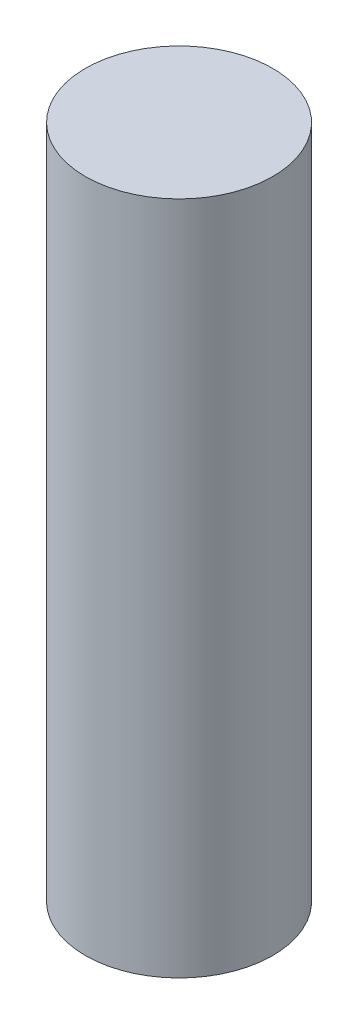
ISO-10303-21;
HEADER;
FILE_DESCRIPTION(('STEP AP214'),'2;1');
FILE_NAME('part.step','',(''),(''),'','','');
FILE_SCHEMA(('AUTOMOTIVE_DESIGN { 1 0 10303 214 1 1 1 1 }'));
ENDSEC;
DATA;
#1=APPLICATION_CONTEXT('core data for automotive mechanical design processes');
#2=APPLICATION_PROTOCOL_DEFINITION('international standard','automotive_design',2000,#1);
#3=PRODUCT_CONTEXT('',#1,'mechanical');
#4=PRODUCT('Part','Part','',(#3));
#5=PRODUCT_RELATED_PRODUCT_CATEGORY('part','',(#4));
#6=PRODUCT_DEFINITION_FORMATION('','',#4);
#7=PRODUCT_DEFINITION_CONTEXT('part definition',#1,'design');
#8=PRODUCT_DEFINITION('design','',#6,#7);
#9=PRODUCT_DEFINITION_SHAPE('','',#8);
#10=(LENGTH_UNIT() NAMED_UNIT(*) SI_UNIT(.MILLI.,.METRE.));
#11=(NAMED_UNIT(*) PLANE_ANGLE_UNIT() SI_UNIT($,.RADIAN.));
#12=(NAMED_UNIT(*) SI_UNIT($,.STERADIAN.) SOLID_ANGLE_UNIT());
#13=UNCERTAINTY_MEASURE_WITH_UNIT(LENGTH_MEASURE(1.E-05),#10,'distance_accuracy_value','');
#14=(GEOMETRIC_REPRESENTATION_CONTEXT(3) GLOBAL_UNCERTAINTY_ASSIGNED_CONTEXT((#13)) GLOBAL_UNIT_ASSIGNED_CONTEXT((#10,
#11,#12)) REPRESENTATION_CONTEXT('',''));
#15=CARTESIAN_POINT('',(0.,0.,0.));
#16=DIRECTION('',(0.,0.,1.));
#17=DIRECTION('',(1.,0.,0.));
#18=AXIS2_PLACEMENT_3D('',#15,#16,#17);
#19=CARTESIAN_POINT('',(0.,18.,0.));
#20=DIRECTION('',(0.,-1.,0.));
#21=DIRECTION('',(0.,0.,-1.));
#22=AXIS2_PLACEMENT_3D('',#19,#20,#21);
#23=CYLINDRICAL_SURFACE('',#22,5.);
#24=CARTESIAN_POINT('',(0.,18.,0.));
#25=DIRECTION('',(0.,1.,0.));
#26=DIRECTION('',(0.,0.,1.));
#27=AXIS2_PLACEMENT_3D('',#24,#25,#26);
#28=CIRCLE('',#27,5.);
#29=CARTESIAN_POINT('',(0.,18.,5.));
#30=VERTEX_POINT('',#29);
#31=EDGE_CURVE('E10',#30,#30,#28,.T.);
#32=ORIENTED_EDGE('',*,*,#31,.F.);
#33=EDGE_LOOP('',(#32));
#34=FACE_BOUND('',#33,.T.);
#35=CARTESIAN_POINT('',(0.,-18.,0.));
#36=DIRECTION('',(0.,1.,0.));
#37=DIRECTION('',(0.,0.,1.));
#38=AXIS2_PLACEMENT_3D('',#35,#36,#37);
#39=CIRCLE('',#38,5.);
#40=CARTESIAN_POINT('',(0.,-18.,5.));
#41=VERTEX_POINT('',#40);
#42=EDGE_CURVE('E38',#41,#41,#39,.T.);
#43=ORIENTED_EDGE('',*,*,#42,.T.);
#44=EDGE_LOOP('',(#43));
#45=FACE_BOUND('',#44,.T.);
#46=ADVANCED_FACE('F35',(#34,#45),#23,.T.);
#47=CARTESIAN_POINT('',(0.,18.,0.));
#48=DIRECTION('',(0.,1.,0.));
#49=DIRECTION('',(0.,0.,1.));
#50=AXIS2_PLACEMENT_3D('',#47,#48,#49);
#51=PLANE('',#50);
#52=ORIENTED_EDGE('',*,*,#31,.T.);
#53=EDGE_LOOP('',(#52));
#54=FACE_BOUND('',#53,.T.);
#55=ADVANCED_FACE('F50',(#54),#51,.T.);
#56=CARTESIAN_POINT('',(0.,-18.,0.));
#57=DIRECTION('',(0.,1.,0.));
#58=DIRECTION('',(0.,0.,1.));
#59=AXIS2_PLACEMENT_3D('',#56,#57,#58);
#60=PLANE('',#59);
#61=ORIENTED_EDGE('',*,*,#42,.F.);
#62=EDGE_LOOP('',(#61));
#63=FACE_BOUND('',#62,.T.);
#64=ADVANCED_FACE('F48',(#63),#60,.F.);
#65=CLOSED_SHELL('',(#46,#55,#64));
#66=MANIFOLD_SOLID_BREP('B2',#65);
#67=ADVANCED_BREP_SHAPE_REPRESENTATION('',(#18,#66),#14);
#68=SHAPE_DEFINITION_REPRESENTATION(#9,#67);
ENDSEC;
END-ISO-10303-21;
